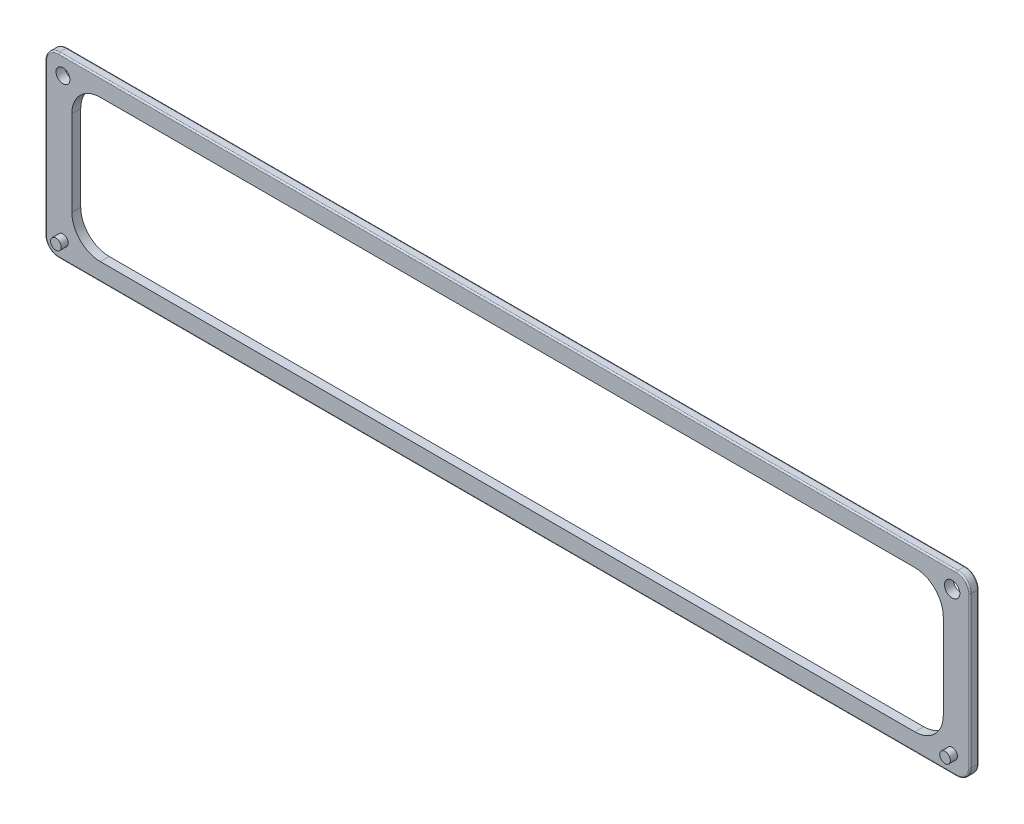
ISO-10303-21;
HEADER;
FILE_DESCRIPTION(('STEP AP214'),'2;1');
FILE_NAME('part.step','',(''),(''),'','','');
FILE_SCHEMA(('AUTOMOTIVE_DESIGN { 1 0 10303 214 1 1 1 1 }'));
ENDSEC;
DATA;
#1=APPLICATION_CONTEXT('core data for automotive mechanical design processes');
#2=APPLICATION_PROTOCOL_DEFINITION('international standard','automotive_design',2000,#1);
#3=PRODUCT_CONTEXT('',#1,'mechanical');
#4=PRODUCT('Part','Part','',(#3));
#5=PRODUCT_RELATED_PRODUCT_CATEGORY('part','',(#4));
#6=PRODUCT_DEFINITION_FORMATION('','',#4);
#7=PRODUCT_DEFINITION_CONTEXT('part definition',#1,'design');
#8=PRODUCT_DEFINITION('design','',#6,#7);
#9=PRODUCT_DEFINITION_SHAPE('','',#8);
#10=(LENGTH_UNIT() NAMED_UNIT(*) SI_UNIT(.MILLI.,.METRE.));
#11=(NAMED_UNIT(*) PLANE_ANGLE_UNIT() SI_UNIT($,.RADIAN.));
#12=(NAMED_UNIT(*) SI_UNIT($,.STERADIAN.) SOLID_ANGLE_UNIT());
#13=UNCERTAINTY_MEASURE_WITH_UNIT(LENGTH_MEASURE(1.E-05),#10,'distance_accuracy_value','');
#14=(GEOMETRIC_REPRESENTATION_CONTEXT(3) GLOBAL_UNCERTAINTY_ASSIGNED_CONTEXT((#13)) GLOBAL_UNIT_ASSIGNED_CONTEXT((#10,
#11,#12)) REPRESENTATION_CONTEXT('',''));
#15=CARTESIAN_POINT('',(0.,0.,0.));
#16=DIRECTION('',(0.,0.,1.));
#17=DIRECTION('',(1.,0.,0.));
#18=AXIS2_PLACEMENT_3D('',#15,#16,#17);
#19=CARTESIAN_POINT('',(41.275,7.9375,0.79375));
#20=DIRECTION('',(-1.,0.,0.));
#21=DIRECTION('',(0.,0.,1.));
#22=AXIS2_PLACEMENT_3D('',#19,#20,#21);
#23=PLANE('',#22);
#24=DIRECTION('',(0.,0.,-1.));
#25=VECTOR('',#24,1.);
#26=CARTESIAN_POINT('',(41.275,6.7437,0.79375));
#27=LINE('',#26,#25);
#28=CARTESIAN_POINT('',(41.275,6.7437,0.127));
#29=VERTEX_POINT('',#28);
#30=CARTESIAN_POINT('',(41.275,6.7437,0.66675));
#31=VERTEX_POINT('',#30);
#32=EDGE_CURVE('E296',#29,#31,#27,.F.);
#33=ORIENTED_EDGE('',*,*,#32,.T.);
#34=DIRECTION('',(0.,1.,0.));
#35=VECTOR('',#34,1.);
#36=CARTESIAN_POINT('',(41.275,-6.7437,0.66675));
#37=LINE('',#36,#35);
#38=CARTESIAN_POINT('',(41.275,-6.7437,0.66675));
#39=VERTEX_POINT('',#38);
#40=EDGE_CURVE('E344',#31,#39,#37,.F.);
#41=ORIENTED_EDGE('',*,*,#40,.T.);
#42=DIRECTION('',(0.,0.,-1.));
#43=VECTOR('',#42,1.);
#44=CARTESIAN_POINT('',(41.275,-6.7437,0.79375));
#45=LINE('',#44,#43);
#46=CARTESIAN_POINT('',(41.275,-6.7437,0.127));
#47=VERTEX_POINT('',#46);
#48=EDGE_CURVE('E293',#39,#47,#45,.T.);
#49=ORIENTED_EDGE('',*,*,#48,.T.);
#50=DIRECTION('',(0.,1.,0.));
#51=VECTOR('',#50,1.);
#52=CARTESIAN_POINT('',(41.275,7.9375,0.127));
#53=LINE('',#52,#51);
#54=EDGE_CURVE('E342',#47,#29,#53,.T.);
#55=ORIENTED_EDGE('',*,*,#54,.T.);
#56=EDGE_LOOP('',(#33,#41,#49,#55));
#57=FACE_BOUND('',#56,.T.);
#58=ADVANCED_FACE('F34',(#57),#23,.F.);
#59=CARTESIAN_POINT('',(-41.275,7.9375,0.79375));
#60=DIRECTION('',(0.,-1.,0.));
#61=DIRECTION('',(0.,0.,-1.));
#62=AXIS2_PLACEMENT_3D('',#59,#60,#61);
#63=PLANE('',#62);
#64=DIRECTION('',(0.,0.,-1.));
#65=VECTOR('',#64,1.);
#66=CARTESIAN_POINT('',(-40.0812,7.9375,0.79375));
#67=LINE('',#66,#65);
#68=CARTESIAN_POINT('',(-40.0812,7.9375,0.127));
#69=VERTEX_POINT('',#68);
#70=CARTESIAN_POINT('',(-40.0812,7.9375,0.66675));
#71=VERTEX_POINT('',#70);
#72=EDGE_CURVE('E287',#69,#71,#67,.F.);
#73=ORIENTED_EDGE('',*,*,#72,.T.);
#74=DIRECTION('',(-1.,0.,0.));
#75=VECTOR('',#74,1.);
#76=CARTESIAN_POINT('',(40.0812,7.9375,0.66675));
#77=LINE('',#76,#75);
#78=CARTESIAN_POINT('',(40.0812,7.9375,0.66675));
#79=VERTEX_POINT('',#78);
#80=EDGE_CURVE('E336',#71,#79,#77,.F.);
#81=ORIENTED_EDGE('',*,*,#80,.T.);
#82=DIRECTION('',(0.,0.,-1.));
#83=VECTOR('',#82,1.);
#84=CARTESIAN_POINT('',(40.0812,7.9375,0.79375));
#85=LINE('',#84,#83);
#86=CARTESIAN_POINT('',(40.0812,7.9375,0.127));
#87=VERTEX_POINT('',#86);
#88=EDGE_CURVE('E290',#79,#87,#85,.T.);
#89=ORIENTED_EDGE('',*,*,#88,.T.);
#90=DIRECTION('',(-1.,0.,0.));
#91=VECTOR('',#90,1.);
#92=CARTESIAN_POINT('',(-41.275,7.9375,0.127));
#93=LINE('',#92,#91);
#94=EDGE_CURVE('E334',#87,#69,#93,.T.);
#95=ORIENTED_EDGE('',*,*,#94,.T.);
#96=EDGE_LOOP('',(#73,#81,#89,#95));
#97=FACE_BOUND('',#96,.T.);
#98=ADVANCED_FACE('F491',(#97),#63,.F.);
#99=CARTESIAN_POINT('',(-41.275,7.9375,0.79375));
#100=DIRECTION('',(1.,0.,0.));
#101=DIRECTION('',(0.,0.,-1.));
#102=AXIS2_PLACEMENT_3D('',#99,#100,#101);
#103=PLANE('',#102);
#104=DIRECTION('',(0.,0.,-1.));
#105=VECTOR('',#104,1.);
#106=CARTESIAN_POINT('',(-41.275,-6.7437,0.79375));
#107=LINE('',#106,#105);
#108=CARTESIAN_POINT('',(-41.275,-6.7437,0.127));
#109=VERTEX_POINT('',#108);
#110=CARTESIAN_POINT('',(-41.275,-6.7437,0.66675));
#111=VERTEX_POINT('',#110);
#112=EDGE_CURVE('E308',#109,#111,#107,.F.);
#113=ORIENTED_EDGE('',*,*,#112,.T.);
#114=DIRECTION('',(0.,-1.,0.));
#115=VECTOR('',#114,1.);
#116=CARTESIAN_POINT('',(-41.275,6.7437,0.66675));
#117=LINE('',#116,#115);
#118=CARTESIAN_POINT('',(-41.275,6.7437,0.66675));
#119=VERTEX_POINT('',#118);
#120=EDGE_CURVE('E11',#111,#119,#117,.F.);
#121=ORIENTED_EDGE('',*,*,#120,.T.);
#122=DIRECTION('',(0.,0.,-1.));
#123=VECTOR('',#122,1.);
#124=CARTESIAN_POINT('',(-41.275,6.7437,0.79375));
#125=LINE('',#124,#123);
#126=CARTESIAN_POINT('',(-41.275,6.7437,0.127));
#127=VERTEX_POINT('',#126);
#128=EDGE_CURVE('E305',#119,#127,#125,.T.);
#129=ORIENTED_EDGE('',*,*,#128,.T.);
#130=DIRECTION('',(0.,-1.,0.));
#131=VECTOR('',#130,1.);
#132=CARTESIAN_POINT('',(-41.275,7.9375,0.127));
#133=LINE('',#132,#131);
#134=EDGE_CURVE('E43',#127,#109,#133,.T.);
#135=ORIENTED_EDGE('',*,*,#134,.T.);
#136=EDGE_LOOP('',(#113,#121,#129,#135));
#137=FACE_BOUND('',#136,.T.);
#138=ADVANCED_FACE('F478',(#137),#103,.F.);
#139=CARTESIAN_POINT('',(-41.275,-7.9375,0.79375));
#140=DIRECTION('',(0.,1.,0.));
#141=DIRECTION('',(0.,0.,1.));
#142=AXIS2_PLACEMENT_3D('',#139,#140,#141);
#143=PLANE('',#142);
#144=DIRECTION('',(0.,0.,-1.));
#145=VECTOR('',#144,1.);
#146=CARTESIAN_POINT('',(40.0812,-7.9375,0.79375));
#147=LINE('',#146,#145);
#148=CARTESIAN_POINT('',(40.0812,-7.9375,0.127));
#149=VERTEX_POINT('',#148);
#150=CARTESIAN_POINT('',(40.0812,-7.9375,0.66675));
#151=VERTEX_POINT('',#150);
#152=EDGE_CURVE('E302',#149,#151,#147,.F.);
#153=ORIENTED_EDGE('',*,*,#152,.T.);
#154=DIRECTION('',(1.,0.,0.));
#155=VECTOR('',#154,1.);
#156=CARTESIAN_POINT('',(-40.0812,-7.9375,0.66675));
#157=LINE('',#156,#155);
#158=CARTESIAN_POINT('',(-40.0812,-7.9375,0.66675));
#159=VERTEX_POINT('',#158);
#160=EDGE_CURVE('E352',#151,#159,#157,.F.);
#161=ORIENTED_EDGE('',*,*,#160,.T.);
#162=DIRECTION('',(0.,0.,-1.));
#163=VECTOR('',#162,1.);
#164=CARTESIAN_POINT('',(-40.0812,-7.9375,0.79375));
#165=LINE('',#164,#163);
#166=CARTESIAN_POINT('',(-40.0812,-7.9375,0.127));
#167=VERTEX_POINT('',#166);
#168=EDGE_CURVE('E299',#159,#167,#165,.T.);
#169=ORIENTED_EDGE('',*,*,#168,.T.);
#170=DIRECTION('',(1.,0.,0.));
#171=VECTOR('',#170,1.);
#172=CARTESIAN_POINT('',(-41.275,-7.9375,0.127));
#173=LINE('',#172,#171);
#174=EDGE_CURVE('E350',#167,#149,#173,.T.);
#175=ORIENTED_EDGE('',*,*,#174,.T.);
#176=EDGE_LOOP('',(#153,#161,#169,#175));
#177=FACE_BOUND('',#176,.T.);
#178=ADVANCED_FACE('F457',(#177),#143,.F.);
#179=CARTESIAN_POINT('',(0.,0.,0.79375));
#180=DIRECTION('',(0.,0.,1.));
#181=DIRECTION('',(1.,0.,0.));
#182=AXIS2_PLACEMENT_3D('',#179,#180,#181);
#183=PLANE('',#182);
#184=DIRECTION('',(-1.,0.,0.));
#185=VECTOR('',#184,1.);
#186=CARTESIAN_POINT('',(-40.0812,7.8105,0.79375));
#187=LINE('',#186,#185);
#188=CARTESIAN_POINT('',(40.0812,7.8105,0.79375));
#189=VERTEX_POINT('',#188);
#190=CARTESIAN_POINT('',(-40.0812,7.8105,0.79375));
#191=VERTEX_POINT('',#190);
#192=EDGE_CURVE('E323',#189,#191,#187,.T.);
#193=ORIENTED_EDGE('',*,*,#192,.T.);
#194=CARTESIAN_POINT('',(-40.0812,6.7437,0.79375));
#195=DIRECTION('',(0.,0.,1.));
#196=DIRECTION('',(1.,0.,0.));
#197=AXIS2_PLACEMENT_3D('',#194,#195,#196);
#198=CIRCLE('',#197,1.0668);
#199=CARTESIAN_POINT('',(-41.148,6.7437,0.79375));
#200=VERTEX_POINT('',#199);
#201=EDGE_CURVE('E325',#191,#200,#198,.T.);
#202=ORIENTED_EDGE('',*,*,#201,.T.);
#203=DIRECTION('',(0.,-1.,0.));
#204=VECTOR('',#203,1.);
#205=CARTESIAN_POINT('',(-41.148,-6.7437,0.79375));
#206=LINE('',#205,#204);
#207=CARTESIAN_POINT('',(-41.148,-6.7437,0.79375));
#208=VERTEX_POINT('',#207);
#209=EDGE_CURVE('E311',#200,#208,#206,.T.);
#210=ORIENTED_EDGE('',*,*,#209,.T.);
#211=CARTESIAN_POINT('',(-40.0812,-6.7437,0.79375));
#212=DIRECTION('',(0.,0.,1.));
#213=DIRECTION('',(1.,0.,0.));
#214=AXIS2_PLACEMENT_3D('',#211,#212,#213);
#215=CIRCLE('',#214,1.0668);
#216=CARTESIAN_POINT('',(-40.0812,-7.8105,0.79375));
#217=VERTEX_POINT('',#216);
#218=EDGE_CURVE('E313',#208,#217,#215,.T.);
#219=ORIENTED_EDGE('',*,*,#218,.T.);
#220=DIRECTION('',(1.,0.,0.));
#221=VECTOR('',#220,1.);
#222=CARTESIAN_POINT('',(40.0812,-7.8105,0.79375));
#223=LINE('',#222,#221);
#224=CARTESIAN_POINT('',(40.0812,-7.8105,0.79375));
#225=VERTEX_POINT('',#224);
#226=EDGE_CURVE('E315',#217,#225,#223,.T.);
#227=ORIENTED_EDGE('',*,*,#226,.T.);
#228=CARTESIAN_POINT('',(40.0812,-6.7437,0.79375));
#229=DIRECTION('',(0.,0.,1.));
#230=DIRECTION('',(1.,0.,0.));
#231=AXIS2_PLACEMENT_3D('',#228,#229,#230);
#232=CIRCLE('',#231,1.0668);
#233=CARTESIAN_POINT('',(41.148,-6.7437,0.79375));
#234=VERTEX_POINT('',#233);
#235=EDGE_CURVE('E317',#225,#234,#232,.T.);
#236=ORIENTED_EDGE('',*,*,#235,.T.);
#237=DIRECTION('',(0.,1.,0.));
#238=VECTOR('',#237,1.);
#239=CARTESIAN_POINT('',(41.148,6.7437,0.79375));
#240=LINE('',#239,#238);
#241=CARTESIAN_POINT('',(41.148,6.7437,0.79375));
#242=VERTEX_POINT('',#241);
#243=EDGE_CURVE('E319',#234,#242,#240,.T.);
#244=ORIENTED_EDGE('',*,*,#243,.T.);
#245=CARTESIAN_POINT('',(40.0812,6.7437,0.79375));
#246=DIRECTION('',(0.,0.,1.));
#247=DIRECTION('',(1.,0.,0.));
#248=AXIS2_PLACEMENT_3D('',#245,#246,#247);
#249=CIRCLE('',#248,1.0668);
#250=EDGE_CURVE('E321',#242,#189,#249,.T.);
#251=ORIENTED_EDGE('',*,*,#250,.T.);
#252=EDGE_LOOP('',(#193,#202,#210,#219,#227,#236,#244,#251));
#253=FACE_BOUND('',#252,.T.);
#254=CARTESIAN_POINT('',(-39.6875,6.35,0.79375));
#255=DIRECTION('',(0.,0.,1.));
#256=DIRECTION('',(1.,0.,0.));
#257=AXIS2_PLACEMENT_3D('',#254,#255,#256);
#258=CIRCLE('',#257,0.622300000000001);
#259=CARTESIAN_POINT('',(-39.0652,6.35,0.79375));
#260=VERTEX_POINT('',#259);
#261=EDGE_CURVE('E229',#260,#260,#258,.T.);
#262=ORIENTED_EDGE('',*,*,#261,.F.);
#263=EDGE_LOOP('',(#262));
#264=FACE_BOUND('',#263,.T.);
#265=CARTESIAN_POINT('',(39.6875,6.35,0.79375));
#266=DIRECTION('',(0.,0.,1.));
#267=DIRECTION('',(1.,0.,0.));
#268=AXIS2_PLACEMENT_3D('',#265,#266,#267);
#269=CIRCLE('',#268,0.685800000000001);
#270=CARTESIAN_POINT('',(40.3733,6.35,0.79375));
#271=VERTEX_POINT('',#270);
#272=EDGE_CURVE('E878',#271,#271,#269,.T.);
#273=ORIENTED_EDGE('',*,*,#272,.F.);
#274=EDGE_LOOP('',(#273));
#275=FACE_BOUND('',#274,.T.);
#276=CARTESIAN_POINT('',(36.35375,-3.81,0.79375));
#277=DIRECTION('',(0.,0.,1.));
#278=DIRECTION('',(1.,0.,0.));
#279=AXIS2_PLACEMENT_3D('',#276,#277,#278);
#280=CIRCLE('',#279,2.54);
#281=CARTESIAN_POINT('',(36.35375,-6.35,0.79375));
#282=VERTEX_POINT('',#281);
#283=CARTESIAN_POINT('',(38.89375,-3.81,0.79375));
#284=VERTEX_POINT('',#283);
#285=EDGE_CURVE('E205',#282,#284,#280,.T.);
#286=ORIENTED_EDGE('',*,*,#285,.F.);
#287=DIRECTION('',(1.,0.,0.));
#288=VECTOR('',#287,1.);
#289=CARTESIAN_POINT('',(-36.35375,-6.35,0.79375));
#290=LINE('',#289,#288);
#291=CARTESIAN_POINT('',(-36.35375,-6.35,0.79375));
#292=VERTEX_POINT('',#291);
#293=EDGE_CURVE('E223',#292,#282,#290,.T.);
#294=ORIENTED_EDGE('',*,*,#293,.F.);
#295=CARTESIAN_POINT('',(-36.35375,-3.81,0.79375));
#296=DIRECTION('',(0.,0.,1.));
#297=DIRECTION('',(1.,0.,0.));
#298=AXIS2_PLACEMENT_3D('',#295,#296,#297);
#299=CIRCLE('',#298,2.54);
#300=CARTESIAN_POINT('',(-38.89375,-3.81,0.79375));
#301=VERTEX_POINT('',#300);
#302=EDGE_CURVE('E226',#301,#292,#299,.T.);
#303=ORIENTED_EDGE('',*,*,#302,.F.);
#304=DIRECTION('',(0.,-1.,0.));
#305=VECTOR('',#304,1.);
#306=CARTESIAN_POINT('',(-38.89375,3.81,0.79375));
#307=LINE('',#306,#305);
#308=CARTESIAN_POINT('',(-38.89375,3.81,0.79375));
#309=VERTEX_POINT('',#308);
#310=EDGE_CURVE('E257',#309,#301,#307,.T.);
#311=ORIENTED_EDGE('',*,*,#310,.F.);
#312=CARTESIAN_POINT('',(-36.35375,3.81,0.79375));
#313=DIRECTION('',(0.,0.,1.));
#314=DIRECTION('',(-1.,0.,0.));
#315=AXIS2_PLACEMENT_3D('',#312,#313,#314);
#316=CIRCLE('',#315,2.54);
#317=CARTESIAN_POINT('',(-36.35375,6.35,0.79375));
#318=VERTEX_POINT('',#317);
#319=EDGE_CURVE('E254',#318,#309,#316,.T.);
#320=ORIENTED_EDGE('',*,*,#319,.F.);
#321=DIRECTION('',(-1.,0.,0.));
#322=VECTOR('',#321,1.);
#323=CARTESIAN_POINT('',(-36.35375,6.35,0.79375));
#324=LINE('',#323,#322);
#325=CARTESIAN_POINT('',(36.35375,6.35,0.79375));
#326=VERTEX_POINT('',#325);
#327=EDGE_CURVE('E251',#326,#318,#324,.T.);
#328=ORIENTED_EDGE('',*,*,#327,.F.);
#329=CARTESIAN_POINT('',(36.35375,3.81,0.79375));
#330=DIRECTION('',(0.,0.,1.));
#331=DIRECTION('',(-1.,0.,0.));
#332=AXIS2_PLACEMENT_3D('',#329,#330,#331);
#333=CIRCLE('',#332,2.54);
#334=CARTESIAN_POINT('',(38.89375,3.81,0.79375));
#335=VERTEX_POINT('',#334);
#336=EDGE_CURVE('E248',#335,#326,#333,.T.);
#337=ORIENTED_EDGE('',*,*,#336,.F.);
#338=DIRECTION('',(0.,1.,0.));
#339=VECTOR('',#338,1.);
#340=CARTESIAN_POINT('',(38.89375,3.81,0.79375));
#341=LINE('',#340,#339);
#342=EDGE_CURVE('E246',#284,#335,#341,.T.);
#343=ORIENTED_EDGE('',*,*,#342,.F.);
#344=EDGE_LOOP('',(#286,#294,#303,#311,#320,#328,#337,#343));
#345=FACE_BOUND('',#344,.T.);
#346=CARTESIAN_POINT('',(-39.6875,-6.35,0.79375));
#347=DIRECTION('',(0.,0.,1.));
#348=DIRECTION('',(-1.,0.,0.));
#349=AXIS2_PLACEMENT_3D('',#346,#347,#348);
#350=CIRCLE('',#349,0.474599000000001);
#351=CARTESIAN_POINT('',(-40.162099,-6.35,0.79375));
#352=VERTEX_POINT('',#351);
#353=EDGE_CURVE('E264',#352,#352,#350,.T.);
#354=ORIENTED_EDGE('',*,*,#353,.F.);
#355=EDGE_LOOP('',(#354));
#356=FACE_BOUND('',#355,.T.);
#357=CARTESIAN_POINT('',(39.6875,-6.35,0.79375));
#358=DIRECTION('',(0.,0.,1.));
#359=DIRECTION('',(1.,0.,0.));
#360=AXIS2_PLACEMENT_3D('',#357,#358,#359);
#361=CIRCLE('',#360,0.474599000000001);
#362=CARTESIAN_POINT('',(40.162099,-6.35,0.79375));
#363=VERTEX_POINT('',#362);
#364=EDGE_CURVE('E284',#363,#363,#361,.T.);
#365=ORIENTED_EDGE('',*,*,#364,.F.);
#366=EDGE_LOOP('',(#365));
#367=FACE_BOUND('',#366,.T.);
#368=ADVANCED_FACE('F447',(#253,#264,#275,#345,#356,#367),#183,.T.);
#369=CARTESIAN_POINT('',(0.,0.,0.));
#370=DIRECTION('',(0.,0.,1.));
#371=DIRECTION('',(1.,0.,0.));
#372=AXIS2_PLACEMENT_3D('',#369,#370,#371);
#373=PLANE('',#372);
#374=DIRECTION('',(0.,-1.,0.));
#375=VECTOR('',#374,1.);
#376=CARTESIAN_POINT('',(-41.148,0.,0.));
#377=LINE('',#376,#375);
#378=CARTESIAN_POINT('',(-41.148,-6.7437,0.));
#379=VERTEX_POINT('',#378);
#380=CARTESIAN_POINT('',(-41.148,6.7437,0.));
#381=VERTEX_POINT('',#380);
#382=EDGE_CURVE('E358',#379,#381,#377,.F.);
#383=ORIENTED_EDGE('',*,*,#382,.T.);
#384=CARTESIAN_POINT('',(-40.0812,6.7437,0.));
#385=DIRECTION('',(0.,0.,1.));
#386=DIRECTION('',(1.,0.,0.));
#387=AXIS2_PLACEMENT_3D('',#384,#385,#386);
#388=CIRCLE('',#387,1.0668);
#389=CARTESIAN_POINT('',(-40.0812,7.8105,0.));
#390=VERTEX_POINT('',#389);
#391=EDGE_CURVE('E371',#381,#390,#388,.F.);
#392=ORIENTED_EDGE('',*,*,#391,.T.);
#393=DIRECTION('',(-1.,0.,0.));
#394=VECTOR('',#393,1.);
#395=CARTESIAN_POINT('',(0.,7.8105,0.));
#396=LINE('',#395,#394);
#397=CARTESIAN_POINT('',(40.0812,7.8105,0.));
#398=VERTEX_POINT('',#397);
#399=EDGE_CURVE('E58',#390,#398,#396,.F.);
#400=ORIENTED_EDGE('',*,*,#399,.T.);
#401=CARTESIAN_POINT('',(40.0812,6.7437,0.));
#402=DIRECTION('',(0.,0.,1.));
#403=DIRECTION('',(1.,0.,0.));
#404=AXIS2_PLACEMENT_3D('',#401,#402,#403);
#405=CIRCLE('',#404,1.0668);
#406=CARTESIAN_POINT('',(41.148,6.7437,0.));
#407=VERTEX_POINT('',#406);
#408=EDGE_CURVE('E368',#398,#407,#405,.F.);
#409=ORIENTED_EDGE('',*,*,#408,.T.);
#410=DIRECTION('',(0.,1.,0.));
#411=VECTOR('',#410,1.);
#412=CARTESIAN_POINT('',(41.148,0.,0.));
#413=LINE('',#412,#411);
#414=CARTESIAN_POINT('',(41.148,-6.7437,0.));
#415=VERTEX_POINT('',#414);
#416=EDGE_CURVE('E366',#407,#415,#413,.F.);
#417=ORIENTED_EDGE('',*,*,#416,.T.);
#418=CARTESIAN_POINT('',(40.0812,-6.7437,0.));
#419=DIRECTION('',(0.,0.,1.));
#420=DIRECTION('',(1.,0.,0.));
#421=AXIS2_PLACEMENT_3D('',#418,#419,#420);
#422=CIRCLE('',#421,1.0668);
#423=CARTESIAN_POINT('',(40.0812,-7.8105,0.));
#424=VERTEX_POINT('',#423);
#425=EDGE_CURVE('E364',#415,#424,#422,.F.);
#426=ORIENTED_EDGE('',*,*,#425,.T.);
#427=DIRECTION('',(1.,0.,0.));
#428=VECTOR('',#427,1.);
#429=CARTESIAN_POINT('',(0.,-7.8105,0.));
#430=LINE('',#429,#428);
#431=CARTESIAN_POINT('',(-40.0812,-7.8105,0.));
#432=VERTEX_POINT('',#431);
#433=EDGE_CURVE('E362',#424,#432,#430,.F.);
#434=ORIENTED_EDGE('',*,*,#433,.T.);
#435=CARTESIAN_POINT('',(-40.0812,-6.7437,0.));
#436=DIRECTION('',(0.,0.,1.));
#437=DIRECTION('',(1.,0.,0.));
#438=AXIS2_PLACEMENT_3D('',#435,#436,#437);
#439=CIRCLE('',#438,1.0668);
#440=EDGE_CURVE('E360',#432,#379,#439,.F.);
#441=ORIENTED_EDGE('',*,*,#440,.T.);
#442=EDGE_LOOP('',(#383,#392,#400,#409,#417,#426,#434,#441));
#443=FACE_BOUND('',#442,.T.);
#444=CARTESIAN_POINT('',(-39.6875,6.35,0.));
#445=DIRECTION('',(0.,0.,1.));
#446=DIRECTION('',(1.,0.,0.));
#447=AXIS2_PLACEMENT_3D('',#444,#445,#446);
#448=CIRCLE('',#447,0.622300000000001);
#449=CARTESIAN_POINT('',(-39.0652,6.35,0.));
#450=VERTEX_POINT('',#449);
#451=EDGE_CURVE('E882',#450,#450,#448,.T.);
#452=ORIENTED_EDGE('',*,*,#451,.T.);
#453=EDGE_LOOP('',(#452));
#454=FACE_BOUND('',#453,.T.);
#455=CARTESIAN_POINT('',(39.6875,6.35,0.));
#456=DIRECTION('',(0.,0.,1.));
#457=DIRECTION('',(1.,0.,0.));
#458=AXIS2_PLACEMENT_3D('',#455,#456,#457);
#459=CIRCLE('',#458,0.685800000000001);
#460=CARTESIAN_POINT('',(40.3733,6.35,0.));
#461=VERTEX_POINT('',#460);
#462=EDGE_CURVE('E396',#461,#461,#459,.T.);
#463=ORIENTED_EDGE('',*,*,#462,.T.);
#464=EDGE_LOOP('',(#463));
#465=FACE_BOUND('',#464,.T.);
#466=DIRECTION('',(1.,0.,0.));
#467=VECTOR('',#466,1.);
#468=CARTESIAN_POINT('',(-36.35375,-6.35,0.));
#469=LINE('',#468,#467);
#470=CARTESIAN_POINT('',(-36.35375,-6.35,0.));
#471=VERTEX_POINT('',#470);
#472=CARTESIAN_POINT('',(36.35375,-6.35,0.));
#473=VERTEX_POINT('',#472);
#474=EDGE_CURVE('E210',#471,#473,#469,.T.);
#475=ORIENTED_EDGE('',*,*,#474,.T.);
#476=CARTESIAN_POINT('',(36.35375,-3.81,0.));
#477=DIRECTION('',(0.,0.,1.));
#478=DIRECTION('',(1.,0.,0.));
#479=AXIS2_PLACEMENT_3D('',#476,#477,#478);
#480=CIRCLE('',#479,2.54);
#481=CARTESIAN_POINT('',(38.89375,-3.81,0.));
#482=VERTEX_POINT('',#481);
#483=EDGE_CURVE('E202',#473,#482,#480,.T.);
#484=ORIENTED_EDGE('',*,*,#483,.T.);
#485=DIRECTION('',(0.,1.,0.));
#486=VECTOR('',#485,1.);
#487=CARTESIAN_POINT('',(38.89375,3.81,0.));
#488=LINE('',#487,#486);
#489=CARTESIAN_POINT('',(38.89375,3.81,0.));
#490=VERTEX_POINT('',#489);
#491=EDGE_CURVE('E214',#482,#490,#488,.T.);
#492=ORIENTED_EDGE('',*,*,#491,.T.);
#493=CARTESIAN_POINT('',(36.35375,3.81,0.));
#494=DIRECTION('',(0.,0.,1.));
#495=DIRECTION('',(-1.,0.,0.));
#496=AXIS2_PLACEMENT_3D('',#493,#494,#495);
#497=CIRCLE('',#496,2.54);
#498=CARTESIAN_POINT('',(36.35375,6.35,0.));
#499=VERTEX_POINT('',#498);
#500=EDGE_CURVE('E218',#490,#499,#497,.T.);
#501=ORIENTED_EDGE('',*,*,#500,.T.);
#502=DIRECTION('',(-1.,0.,0.));
#503=VECTOR('',#502,1.);
#504=CARTESIAN_POINT('',(-36.35375,6.35,0.));
#505=LINE('',#504,#503);
#506=CARTESIAN_POINT('',(-36.35375,6.35,0.));
#507=VERTEX_POINT('',#506);
#508=EDGE_CURVE('E233',#499,#507,#505,.T.);
#509=ORIENTED_EDGE('',*,*,#508,.T.);
#510=CARTESIAN_POINT('',(-36.35375,3.81,0.));
#511=DIRECTION('',(0.,0.,1.));
#512=DIRECTION('',(-1.,0.,0.));
#513=AXIS2_PLACEMENT_3D('',#510,#511,#512);
#514=CIRCLE('',#513,2.54);
#515=CARTESIAN_POINT('',(-38.89375,3.81,0.));
#516=VERTEX_POINT('',#515);
#517=EDGE_CURVE('E236',#507,#516,#514,.T.);
#518=ORIENTED_EDGE('',*,*,#517,.T.);
#519=DIRECTION('',(0.,-1.,0.));
#520=VECTOR('',#519,1.);
#521=CARTESIAN_POINT('',(-38.89375,3.81,0.));
#522=LINE('',#521,#520);
#523=CARTESIAN_POINT('',(-38.89375,-3.81,0.));
#524=VERTEX_POINT('',#523);
#525=EDGE_CURVE('E239',#516,#524,#522,.T.);
#526=ORIENTED_EDGE('',*,*,#525,.T.);
#527=CARTESIAN_POINT('',(-36.35375,-3.81,0.));
#528=DIRECTION('',(0.,0.,1.));
#529=DIRECTION('',(1.,0.,0.));
#530=AXIS2_PLACEMENT_3D('',#527,#528,#529);
#531=CIRCLE('',#530,2.54);
#532=EDGE_CURVE('E242',#524,#471,#531,.T.);
#533=ORIENTED_EDGE('',*,*,#532,.T.);
#534=EDGE_LOOP('',(#475,#484,#492,#501,#509,#518,#526,#533));
#535=FACE_BOUND('',#534,.T.);
#536=ADVANCED_FACE('F220',(#443,#454,#465,#535),#373,.F.);
#537=CARTESIAN_POINT('',(39.6875,-6.35,1.42875));
#538=DIRECTION('',(0.,0.,-1.));
#539=DIRECTION('',(-1.,0.,0.));
#540=AXIS2_PLACEMENT_3D('',#537,#538,#539);
#541=CYLINDRICAL_SURFACE('',#540,0.474599000000001);
#542=CARTESIAN_POINT('',(39.6875,-6.35,1.42875));
#543=DIRECTION('',(0.,0.,-1.));
#544=DIRECTION('',(1.,0.,0.));
#545=AXIS2_PLACEMENT_3D('',#542,#543,#544);
#546=CIRCLE('',#545,0.474599000000001);
#547=CARTESIAN_POINT('',(40.162099,-6.35,1.42875));
#548=VERTEX_POINT('',#547);
#549=EDGE_CURVE('E279',#548,#548,#546,.T.);
#550=ORIENTED_EDGE('',*,*,#549,.T.);
#551=EDGE_LOOP('',(#550));
#552=FACE_BOUND('',#551,.T.);
#553=ORIENTED_EDGE('',*,*,#364,.T.);
#554=EDGE_LOOP('',(#553));
#555=FACE_BOUND('',#554,.T.);
#556=ADVANCED_FACE('F777',(#552,#555),#541,.T.);
#557=CARTESIAN_POINT('',(39.6875,-6.35,1.42875));
#558=DIRECTION('',(0.,0.,1.));
#559=DIRECTION('',(1.,0.,0.));
#560=AXIS2_PLACEMENT_3D('',#557,#558,#559);
#561=PLANE('',#560);
#562=ORIENTED_EDGE('',*,*,#549,.F.);
#563=EDGE_LOOP('',(#562));
#564=FACE_BOUND('',#563,.T.);
#565=ADVANCED_FACE('F768',(#564),#561,.T.);
#566=CARTESIAN_POINT('',(-39.6875,-6.35,1.42875));
#567=DIRECTION('',(0.,0.,-1.));
#568=DIRECTION('',(-1.,0.,0.));
#569=AXIS2_PLACEMENT_3D('',#566,#567,#568);
#570=CYLINDRICAL_SURFACE('',#569,0.474599000000001);
#571=CARTESIAN_POINT('',(-39.6875,-6.35,1.42875));
#572=DIRECTION('',(0.,0.,1.));
#573=DIRECTION('',(-1.,0.,0.));
#574=AXIS2_PLACEMENT_3D('',#571,#572,#573);
#575=CIRCLE('',#574,0.474599000000001);
#576=CARTESIAN_POINT('',(-40.162099,-6.35,1.42875));
#577=VERTEX_POINT('',#576);
#578=EDGE_CURVE('E276',#577,#577,#575,.T.);
#579=ORIENTED_EDGE('',*,*,#578,.F.);
#580=EDGE_LOOP('',(#579));
#581=FACE_BOUND('',#580,.T.);
#582=ORIENTED_EDGE('',*,*,#353,.T.);
#583=EDGE_LOOP('',(#582));
#584=FACE_BOUND('',#583,.T.);
#585=ADVANCED_FACE('F759',(#581,#584),#570,.T.);
#586=CARTESIAN_POINT('',(-39.6875,-6.35,1.42875));
#587=DIRECTION('',(0.,0.,1.));
#588=DIRECTION('',(-1.,0.,0.));
#589=AXIS2_PLACEMENT_3D('',#586,#587,#588);
#590=PLANE('',#589);
#591=ORIENTED_EDGE('',*,*,#578,.T.);
#592=EDGE_LOOP('',(#591));
#593=FACE_BOUND('',#592,.T.);
#594=ADVANCED_FACE('F751',(#593),#590,.T.);
#595=CARTESIAN_POINT('',(36.35375,-3.81,0.));
#596=DIRECTION('',(0.,0.,1.));
#597=DIRECTION('',(1.,0.,0.));
#598=AXIS2_PLACEMENT_3D('',#595,#596,#597);
#599=CYLINDRICAL_SURFACE('',#598,2.54);
#600=ORIENTED_EDGE('',*,*,#285,.T.);
#601=DIRECTION('',(0.,0.,1.));
#602=VECTOR('',#601,1.);
#603=CARTESIAN_POINT('',(38.89375,-3.81,0.));
#604=LINE('',#603,#602);
#605=EDGE_CURVE('E198',#482,#284,#604,.T.);
#606=ORIENTED_EDGE('',*,*,#605,.F.);
#607=ORIENTED_EDGE('',*,*,#483,.F.);
#608=DIRECTION('',(0.,0.,1.));
#609=VECTOR('',#608,1.);
#610=CARTESIAN_POINT('',(36.35375,-6.35,0.));
#611=LINE('',#610,#609);
#612=EDGE_CURVE('E262',#473,#282,#611,.T.);
#613=ORIENTED_EDGE('',*,*,#612,.T.);
#614=EDGE_LOOP('',(#600,#606,#607,#613));
#615=FACE_BOUND('',#614,.T.);
#616=ADVANCED_FACE('F200',(#615),#599,.F.);
#617=CARTESIAN_POINT('',(-36.35375,-6.35,0.));
#618=DIRECTION('',(0.,-1.,0.));
#619=DIRECTION('',(0.,0.,-1.));
#620=AXIS2_PLACEMENT_3D('',#617,#618,#619);
#621=PLANE('',#620);
#622=ORIENTED_EDGE('',*,*,#293,.T.);
#623=ORIENTED_EDGE('',*,*,#612,.F.);
#624=ORIENTED_EDGE('',*,*,#474,.F.);
#625=DIRECTION('',(0.,0.,1.));
#626=VECTOR('',#625,1.);
#627=CARTESIAN_POINT('',(-36.35375,-6.35,0.));
#628=LINE('',#627,#626);
#629=EDGE_CURVE('E265',#471,#292,#628,.T.);
#630=ORIENTED_EDGE('',*,*,#629,.T.);
#631=EDGE_LOOP('',(#622,#623,#624,#630));
#632=FACE_BOUND('',#631,.T.);
#633=ADVANCED_FACE('F734',(#632),#621,.F.);
#634=CARTESIAN_POINT('',(-36.35375,-3.81,0.));
#635=DIRECTION('',(0.,0.,1.));
#636=DIRECTION('',(1.,0.,0.));
#637=AXIS2_PLACEMENT_3D('',#634,#635,#636);
#638=CYLINDRICAL_SURFACE('',#637,2.54);
#639=ORIENTED_EDGE('',*,*,#302,.T.);
#640=ORIENTED_EDGE('',*,*,#629,.F.);
#641=ORIENTED_EDGE('',*,*,#532,.F.);
#642=DIRECTION('',(0.,0.,1.));
#643=VECTOR('',#642,1.);
#644=CARTESIAN_POINT('',(-38.89375,-3.81,0.));
#645=LINE('',#644,#643);
#646=EDGE_CURVE('E267',#524,#301,#645,.T.);
#647=ORIENTED_EDGE('',*,*,#646,.T.);
#648=EDGE_LOOP('',(#639,#640,#641,#647));
#649=FACE_BOUND('',#648,.T.);
#650=ADVANCED_FACE('F725',(#649),#638,.F.);
#651=CARTESIAN_POINT('',(-38.89375,3.81,0.));
#652=DIRECTION('',(-1.,0.,0.));
#653=DIRECTION('',(0.,0.,1.));
#654=AXIS2_PLACEMENT_3D('',#651,#652,#653);
#655=PLANE('',#654);
#656=ORIENTED_EDGE('',*,*,#310,.T.);
#657=ORIENTED_EDGE('',*,*,#646,.F.);
#658=ORIENTED_EDGE('',*,*,#525,.F.);
#659=DIRECTION('',(0.,0.,1.));
#660=VECTOR('',#659,1.);
#661=CARTESIAN_POINT('',(-38.89375,3.81,0.));
#662=LINE('',#661,#660);
#663=EDGE_CURVE('E269',#516,#309,#662,.T.);
#664=ORIENTED_EDGE('',*,*,#663,.T.);
#665=EDGE_LOOP('',(#656,#657,#658,#664));
#666=FACE_BOUND('',#665,.T.);
#667=ADVANCED_FACE('F716',(#666),#655,.F.);
#668=CARTESIAN_POINT('',(-36.35375,3.81,0.));
#669=DIRECTION('',(0.,0.,1.));
#670=DIRECTION('',(1.,0.,0.));
#671=AXIS2_PLACEMENT_3D('',#668,#669,#670);
#672=CYLINDRICAL_SURFACE('',#671,2.54);
#673=ORIENTED_EDGE('',*,*,#319,.T.);
#674=ORIENTED_EDGE('',*,*,#663,.F.);
#675=ORIENTED_EDGE('',*,*,#517,.F.);
#676=DIRECTION('',(0.,0.,1.));
#677=VECTOR('',#676,1.);
#678=CARTESIAN_POINT('',(-36.35375,6.35,0.));
#679=LINE('',#678,#677);
#680=EDGE_CURVE('E271',#507,#318,#679,.T.);
#681=ORIENTED_EDGE('',*,*,#680,.T.);
#682=EDGE_LOOP('',(#673,#674,#675,#681));
#683=FACE_BOUND('',#682,.T.);
#684=ADVANCED_FACE('F707',(#683),#672,.F.);
#685=CARTESIAN_POINT('',(-36.35375,6.35,0.));
#686=DIRECTION('',(0.,1.,0.));
#687=DIRECTION('',(0.,0.,1.));
#688=AXIS2_PLACEMENT_3D('',#685,#686,#687);
#689=PLANE('',#688);
#690=ORIENTED_EDGE('',*,*,#327,.T.);
#691=ORIENTED_EDGE('',*,*,#680,.F.);
#692=ORIENTED_EDGE('',*,*,#508,.F.);
#693=DIRECTION('',(0.,0.,1.));
#694=VECTOR('',#693,1.);
#695=CARTESIAN_POINT('',(36.35375,6.35,0.));
#696=LINE('',#695,#694);
#697=EDGE_CURVE('E273',#499,#326,#696,.T.);
#698=ORIENTED_EDGE('',*,*,#697,.T.);
#699=EDGE_LOOP('',(#690,#691,#692,#698));
#700=FACE_BOUND('',#699,.T.);
#701=ADVANCED_FACE('F698',(#700),#689,.F.);
#702=CARTESIAN_POINT('',(36.35375,3.81,0.));
#703=DIRECTION('',(0.,0.,1.));
#704=DIRECTION('',(1.,0.,0.));
#705=AXIS2_PLACEMENT_3D('',#702,#703,#704);
#706=CYLINDRICAL_SURFACE('',#705,2.54);
#707=ORIENTED_EDGE('',*,*,#336,.T.);
#708=ORIENTED_EDGE('',*,*,#697,.F.);
#709=ORIENTED_EDGE('',*,*,#500,.F.);
#710=DIRECTION('',(0.,0.,1.));
#711=VECTOR('',#710,1.);
#712=CARTESIAN_POINT('',(38.89375,3.81,0.));
#713=LINE('',#712,#711);
#714=EDGE_CURVE('E209',#490,#335,#713,.T.);
#715=ORIENTED_EDGE('',*,*,#714,.T.);
#716=EDGE_LOOP('',(#707,#708,#709,#715));
#717=FACE_BOUND('',#716,.T.);
#718=ADVANCED_FACE('F690',(#717),#706,.F.);
#719=CARTESIAN_POINT('',(38.89375,3.81,0.));
#720=DIRECTION('',(1.,0.,0.));
#721=DIRECTION('',(0.,1.,0.));
#722=AXIS2_PLACEMENT_3D('',#719,#720,#721);
#723=PLANE('',#722);
#724=ORIENTED_EDGE('',*,*,#342,.T.);
#725=ORIENTED_EDGE('',*,*,#714,.F.);
#726=ORIENTED_EDGE('',*,*,#491,.F.);
#727=ORIENTED_EDGE('',*,*,#605,.T.);
#728=EDGE_LOOP('',(#724,#725,#726,#727));
#729=FACE_BOUND('',#728,.T.);
#730=ADVANCED_FACE('F215',(#729),#723,.F.);
#731=CARTESIAN_POINT('',(39.6875,6.35,0.));
#732=DIRECTION('',(0.,0.,1.));
#733=DIRECTION('',(1.,0.,0.));
#734=AXIS2_PLACEMENT_3D('',#731,#732,#733);
#735=CYLINDRICAL_SURFACE('',#734,0.685800000000001);
#736=ORIENTED_EDGE('',*,*,#272,.T.);
#737=EDGE_LOOP('',(#736));
#738=FACE_BOUND('',#737,.T.);
#739=ORIENTED_EDGE('',*,*,#462,.F.);
#740=EDGE_LOOP('',(#739));
#741=FACE_BOUND('',#740,.T.);
#742=ADVANCED_FACE('F673',(#738,#741),#735,.F.);
#743=CARTESIAN_POINT('',(-39.6875,6.35,0.));
#744=DIRECTION('',(0.,0.,1.));
#745=DIRECTION('',(1.,0.,0.));
#746=AXIS2_PLACEMENT_3D('',#743,#744,#745);
#747=CYLINDRICAL_SURFACE('',#746,0.622300000000001);
#748=ORIENTED_EDGE('',*,*,#261,.T.);
#749=EDGE_LOOP('',(#748));
#750=FACE_BOUND('',#749,.T.);
#751=ORIENTED_EDGE('',*,*,#451,.F.);
#752=EDGE_LOOP('',(#751));
#753=FACE_BOUND('',#752,.T.);
#754=ADVANCED_FACE('F531',(#750,#753),#747,.F.);
#755=CARTESIAN_POINT('',(40.0812,6.7437,0.79375));
#756=DIRECTION('',(0.,0.,-1.));
#757=DIRECTION('',(-1.,0.,0.));
#758=AXIS2_PLACEMENT_3D('',#755,#756,#757);
#759=CYLINDRICAL_SURFACE('',#758,1.1938);
#760=ORIENTED_EDGE('',*,*,#88,.F.);
#761=CARTESIAN_POINT('',(40.0812,6.7437,0.66675));
#762=DIRECTION('',(0.,0.,1.));
#763=DIRECTION('',(1.,0.,0.));
#764=AXIS2_PLACEMENT_3D('',#761,#762,#763);
#765=CIRCLE('',#764,1.1938);
#766=EDGE_CURVE('E340',#79,#31,#765,.F.);
#767=ORIENTED_EDGE('',*,*,#766,.T.);
#768=ORIENTED_EDGE('',*,*,#32,.F.);
#769=CARTESIAN_POINT('',(40.0812,6.7437,0.127));
#770=DIRECTION('',(0.,0.,1.));
#771=DIRECTION('',(1.,0.,0.));
#772=AXIS2_PLACEMENT_3D('',#769,#770,#771);
#773=CIRCLE('',#772,1.1938);
#774=EDGE_CURVE('E338',#29,#87,#773,.T.);
#775=ORIENTED_EDGE('',*,*,#774,.T.);
#776=EDGE_LOOP('',(#760,#767,#768,#775));
#777=FACE_BOUND('',#776,.T.);
#778=ADVANCED_FACE('F494',(#777),#759,.T.);
#779=CARTESIAN_POINT('',(40.0812,-6.7437,0.79375));
#780=DIRECTION('',(0.,0.,-1.));
#781=DIRECTION('',(-1.,0.,0.));
#782=AXIS2_PLACEMENT_3D('',#779,#780,#781);
#783=CYLINDRICAL_SURFACE('',#782,1.1938);
#784=ORIENTED_EDGE('',*,*,#48,.F.);
#785=CARTESIAN_POINT('',(40.0812,-6.7437,0.66675));
#786=DIRECTION('',(0.,0.,1.));
#787=DIRECTION('',(1.,0.,0.));
#788=AXIS2_PLACEMENT_3D('',#785,#786,#787);
#789=CIRCLE('',#788,1.1938);
#790=EDGE_CURVE('E348',#39,#151,#789,.F.);
#791=ORIENTED_EDGE('',*,*,#790,.T.);
#792=ORIENTED_EDGE('',*,*,#152,.F.);
#793=CARTESIAN_POINT('',(40.0812,-6.7437,0.127));
#794=DIRECTION('',(0.,0.,1.));
#795=DIRECTION('',(1.,0.,0.));
#796=AXIS2_PLACEMENT_3D('',#793,#794,#795);
#797=CIRCLE('',#796,1.1938);
#798=EDGE_CURVE('E346',#149,#47,#797,.T.);
#799=ORIENTED_EDGE('',*,*,#798,.T.);
#800=EDGE_LOOP('',(#784,#791,#792,#799));
#801=FACE_BOUND('',#800,.T.);
#802=ADVANCED_FACE('F430',(#801),#783,.T.);
#803=CARTESIAN_POINT('',(-40.0812,-6.7437,0.79375));
#804=DIRECTION('',(0.,0.,-1.));
#805=DIRECTION('',(-1.,0.,0.));
#806=AXIS2_PLACEMENT_3D('',#803,#804,#805);
#807=CYLINDRICAL_SURFACE('',#806,1.1938);
#808=ORIENTED_EDGE('',*,*,#168,.F.);
#809=CARTESIAN_POINT('',(-40.0812,-6.7437,0.66675));
#810=DIRECTION('',(0.,0.,1.));
#811=DIRECTION('',(1.,0.,0.));
#812=AXIS2_PLACEMENT_3D('',#809,#810,#811);
#813=CIRCLE('',#812,1.1938);
#814=EDGE_CURVE('E356',#159,#111,#813,.F.);
#815=ORIENTED_EDGE('',*,*,#814,.T.);
#816=ORIENTED_EDGE('',*,*,#112,.F.);
#817=CARTESIAN_POINT('',(-40.0812,-6.7437,0.127));
#818=DIRECTION('',(0.,0.,1.));
#819=DIRECTION('',(1.,0.,0.));
#820=AXIS2_PLACEMENT_3D('',#817,#818,#819);
#821=CIRCLE('',#820,1.1938);
#822=EDGE_CURVE('E354',#109,#167,#821,.T.);
#823=ORIENTED_EDGE('',*,*,#822,.T.);
#824=EDGE_LOOP('',(#808,#815,#816,#823));
#825=FACE_BOUND('',#824,.T.);
#826=ADVANCED_FACE('F461',(#825),#807,.T.);
#827=CARTESIAN_POINT('',(-40.0812,6.7437,0.79375));
#828=DIRECTION('',(0.,0.,-1.));
#829=DIRECTION('',(-1.,0.,0.));
#830=AXIS2_PLACEMENT_3D('',#827,#828,#829);
#831=CYLINDRICAL_SURFACE('',#830,1.1938);
#832=ORIENTED_EDGE('',*,*,#128,.F.);
#833=CARTESIAN_POINT('',(-40.0812,6.7437,0.66675));
#834=DIRECTION('',(0.,0.,1.));
#835=DIRECTION('',(1.,0.,0.));
#836=AXIS2_PLACEMENT_3D('',#833,#834,#835);
#837=CIRCLE('',#836,1.1938);
#838=EDGE_CURVE('E331',#119,#71,#837,.F.);
#839=ORIENTED_EDGE('',*,*,#838,.T.);
#840=ORIENTED_EDGE('',*,*,#72,.F.);
#841=CARTESIAN_POINT('',(-40.0812,6.7437,0.127));
#842=DIRECTION('',(0.,0.,1.));
#843=DIRECTION('',(1.,0.,0.));
#844=AXIS2_PLACEMENT_3D('',#841,#842,#843);
#845=CIRCLE('',#844,1.1938);
#846=EDGE_CURVE('E328',#69,#127,#845,.T.);
#847=ORIENTED_EDGE('',*,*,#846,.T.);
#848=EDGE_LOOP('',(#832,#839,#840,#847));
#849=FACE_BOUND('',#848,.T.);
#850=ADVANCED_FACE('F481',(#849),#831,.T.);
#851=CARTESIAN_POINT('',(40.0812,-6.7437,0.66675));
#852=DIRECTION('',(0.,0.,1.));
#853=DIRECTION('',(1.,0.,0.));
#854=AXIS2_PLACEMENT_3D('',#851,#852,#853);
#855=TOROIDAL_SURFACE('',#854,1.0668,0.127);
#856=CARTESIAN_POINT('',(40.0812,-7.8105,0.66675));
#857=DIRECTION('',(-1.,0.,0.));
#858=DIRECTION('',(0.,0.,1.));
#859=AXIS2_PLACEMENT_3D('',#856,#857,#858);
#860=CIRCLE('',#859,0.127);
#861=EDGE_CURVE('E390',#151,#225,#860,.T.);
#862=ORIENTED_EDGE('',*,*,#861,.F.);
#863=ORIENTED_EDGE('',*,*,#790,.F.);
#864=CARTESIAN_POINT('',(41.148,-6.7437,0.66675));
#865=DIRECTION('',(0.,1.,0.));
#866=DIRECTION('',(0.,0.,1.));
#867=AXIS2_PLACEMENT_3D('',#864,#865,#866);
#868=CIRCLE('',#867,0.127);
#869=EDGE_CURVE('E393',#234,#39,#868,.T.);
#870=ORIENTED_EDGE('',*,*,#869,.F.);
#871=ORIENTED_EDGE('',*,*,#235,.F.);
#872=EDGE_LOOP('',(#862,#863,#870,#871));
#873=FACE_BOUND('',#872,.T.);
#874=ADVANCED_FACE('F454',(#873),#855,.T.);
#875=CARTESIAN_POINT('',(41.148,0.,0.66675));
#876=DIRECTION('',(0.,-1.,0.));
#877=DIRECTION('',(0.,0.,-1.));
#878=AXIS2_PLACEMENT_3D('',#875,#876,#877);
#879=CYLINDRICAL_SURFACE('',#878,0.127);
#880=ORIENTED_EDGE('',*,*,#869,.T.);
#881=ORIENTED_EDGE('',*,*,#40,.F.);
#882=CARTESIAN_POINT('',(41.148,6.7437,0.66675));
#883=DIRECTION('',(0.,1.,0.));
#884=DIRECTION('',(0.,0.,1.));
#885=AXIS2_PLACEMENT_3D('',#882,#883,#884);
#886=CIRCLE('',#885,0.127);
#887=EDGE_CURVE('E387',#242,#31,#886,.T.);
#888=ORIENTED_EDGE('',*,*,#887,.F.);
#889=ORIENTED_EDGE('',*,*,#243,.F.);
#890=EDGE_LOOP('',(#880,#881,#888,#889));
#891=FACE_BOUND('',#890,.T.);
#892=ADVANCED_FACE('F437',(#891),#879,.T.);
#893=CARTESIAN_POINT('',(0.,-7.8105,0.66675));
#894=DIRECTION('',(-1.,0.,0.));
#895=DIRECTION('',(0.,0.,1.));
#896=AXIS2_PLACEMENT_3D('',#893,#894,#895);
#897=CYLINDRICAL_SURFACE('',#896,0.127);
#898=ORIENTED_EDGE('',*,*,#861,.T.);
#899=ORIENTED_EDGE('',*,*,#226,.F.);
#900=CARTESIAN_POINT('',(-40.0812,-7.8105,0.66675));
#901=DIRECTION('',(-1.,0.,0.));
#902=DIRECTION('',(0.,0.,1.));
#903=AXIS2_PLACEMENT_3D('',#900,#901,#902);
#904=CIRCLE('',#903,0.127);
#905=EDGE_CURVE('E384',#159,#217,#904,.T.);
#906=ORIENTED_EDGE('',*,*,#905,.F.);
#907=ORIENTED_EDGE('',*,*,#160,.F.);
#908=EDGE_LOOP('',(#898,#899,#906,#907));
#909=FACE_BOUND('',#908,.T.);
#910=ADVANCED_FACE('F466',(#909),#897,.T.);
#911=CARTESIAN_POINT('',(40.0812,6.7437,0.66675));
#912=DIRECTION('',(0.,0.,1.));
#913=DIRECTION('',(1.,0.,0.));
#914=AXIS2_PLACEMENT_3D('',#911,#912,#913);
#915=TOROIDAL_SURFACE('',#914,1.0668,0.127);
#916=ORIENTED_EDGE('',*,*,#887,.T.);
#917=ORIENTED_EDGE('',*,*,#766,.F.);
#918=CARTESIAN_POINT('',(40.0812,7.8105,0.66675));
#919=DIRECTION('',(-1.,0.,0.));
#920=DIRECTION('',(0.,0.,1.));
#921=AXIS2_PLACEMENT_3D('',#918,#919,#920);
#922=CIRCLE('',#921,0.127);
#923=EDGE_CURVE('E381',#189,#79,#922,.T.);
#924=ORIENTED_EDGE('',*,*,#923,.F.);
#925=ORIENTED_EDGE('',*,*,#250,.F.);
#926=EDGE_LOOP('',(#916,#917,#924,#925));
#927=FACE_BOUND('',#926,.T.);
#928=ADVANCED_FACE('F443',(#927),#915,.T.);
#929=CARTESIAN_POINT('',(-40.0812,-6.7437,0.66675));
#930=DIRECTION('',(0.,0.,1.));
#931=DIRECTION('',(1.,0.,0.));
#932=AXIS2_PLACEMENT_3D('',#929,#930,#931);
#933=TOROIDAL_SURFACE('',#932,1.0668,0.127);
#934=ORIENTED_EDGE('',*,*,#905,.T.);
#935=ORIENTED_EDGE('',*,*,#218,.F.);
#936=CARTESIAN_POINT('',(-41.148,-6.7437,0.66675));
#937=DIRECTION('',(0.,1.,0.));
#938=DIRECTION('',(0.,0.,1.));
#939=AXIS2_PLACEMENT_3D('',#936,#937,#938);
#940=CIRCLE('',#939,0.127);
#941=EDGE_CURVE('E378',#111,#208,#940,.T.);
#942=ORIENTED_EDGE('',*,*,#941,.F.);
#943=ORIENTED_EDGE('',*,*,#814,.F.);
#944=EDGE_LOOP('',(#934,#935,#942,#943));
#945=FACE_BOUND('',#944,.T.);
#946=ADVANCED_FACE('F470',(#945),#933,.T.);
#947=CARTESIAN_POINT('',(0.,7.8105,0.66675));
#948=DIRECTION('',(1.,0.,0.));
#949=DIRECTION('',(0.,0.,-1.));
#950=AXIS2_PLACEMENT_3D('',#947,#948,#949);
#951=CYLINDRICAL_SURFACE('',#950,0.127);
#952=ORIENTED_EDGE('',*,*,#923,.T.);
#953=ORIENTED_EDGE('',*,*,#80,.F.);
#954=CARTESIAN_POINT('',(-40.0812,7.8105,0.66675));
#955=DIRECTION('',(-1.,0.,0.));
#956=DIRECTION('',(0.,0.,1.));
#957=AXIS2_PLACEMENT_3D('',#954,#955,#956);
#958=CIRCLE('',#957,0.127);
#959=EDGE_CURVE('E376',#191,#71,#958,.T.);
#960=ORIENTED_EDGE('',*,*,#959,.F.);
#961=ORIENTED_EDGE('',*,*,#192,.F.);
#962=EDGE_LOOP('',(#952,#953,#960,#961));
#963=FACE_BOUND('',#962,.T.);
#964=ADVANCED_FACE('F488',(#963),#951,.T.);
#965=CARTESIAN_POINT('',(-41.148,0.,0.66675));
#966=DIRECTION('',(0.,1.,0.));
#967=DIRECTION('',(0.,0.,1.));
#968=AXIS2_PLACEMENT_3D('',#965,#966,#967);
#969=CYLINDRICAL_SURFACE('',#968,0.127);
#970=ORIENTED_EDGE('',*,*,#941,.T.);
#971=ORIENTED_EDGE('',*,*,#209,.F.);
#972=CARTESIAN_POINT('',(-41.148,6.7437,0.66675));
#973=DIRECTION('',(0.,1.,0.));
#974=DIRECTION('',(0.,0.,1.));
#975=AXIS2_PLACEMENT_3D('',#972,#973,#974);
#976=CIRCLE('',#975,0.127);
#977=EDGE_CURVE('E374',#119,#200,#976,.T.);
#978=ORIENTED_EDGE('',*,*,#977,.F.);
#979=ORIENTED_EDGE('',*,*,#120,.F.);
#980=EDGE_LOOP('',(#970,#971,#978,#979));
#981=FACE_BOUND('',#980,.T.);
#982=ADVANCED_FACE('F475',(#981),#969,.T.);
#983=CARTESIAN_POINT('',(-40.0812,6.7437,0.66675));
#984=DIRECTION('',(0.,0.,1.));
#985=DIRECTION('',(1.,0.,0.));
#986=AXIS2_PLACEMENT_3D('',#983,#984,#985);
#987=TOROIDAL_SURFACE('',#986,1.0668,0.127);
#988=ORIENTED_EDGE('',*,*,#959,.T.);
#989=ORIENTED_EDGE('',*,*,#838,.F.);
#990=ORIENTED_EDGE('',*,*,#977,.T.);
#991=ORIENTED_EDGE('',*,*,#201,.F.);
#992=EDGE_LOOP('',(#988,#989,#990,#991));
#993=FACE_BOUND('',#992,.T.);
#994=ADVANCED_FACE('F484',(#993),#987,.T.);
#995=CARTESIAN_POINT('',(40.0812,-6.7437,0.127));
#996=DIRECTION('',(0.,0.,1.));
#997=DIRECTION('',(1.,0.,0.));
#998=AXIS2_PLACEMENT_3D('',#995,#996,#997);
#999=TOROIDAL_SURFACE('',#998,1.0668,0.127);
#1000=CARTESIAN_POINT('',(41.148,-6.7437,0.127));
#1001=DIRECTION('',(0.,1.,0.));
#1002=DIRECTION('',(0.,0.,1.));
#1003=AXIS2_PLACEMENT_3D('',#1000,#1001,#1002);
#1004=CIRCLE('',#1003,0.127);
#1005=EDGE_CURVE('E411',#47,#415,#1004,.T.);
#1006=ORIENTED_EDGE('',*,*,#1005,.F.);
#1007=ORIENTED_EDGE('',*,*,#798,.F.);
#1008=CARTESIAN_POINT('',(40.0812,-7.8105,0.127));
#1009=DIRECTION('',(-1.,0.,0.));
#1010=DIRECTION('',(0.,0.,1.));
#1011=AXIS2_PLACEMENT_3D('',#1008,#1009,#1010);
#1012=CIRCLE('',#1011,0.127);
#1013=EDGE_CURVE('E38',#424,#149,#1012,.T.);
#1014=ORIENTED_EDGE('',*,*,#1013,.F.);
#1015=ORIENTED_EDGE('',*,*,#425,.F.);
#1016=EDGE_LOOP('',(#1006,#1007,#1014,#1015));
#1017=FACE_BOUND('',#1016,.T.);
#1018=ADVANCED_FACE('F36',(#1017),#999,.T.);
#1019=CARTESIAN_POINT('',(-41.275,-7.8105,0.127));
#1020=DIRECTION('',(1.,0.,0.));
#1021=DIRECTION('',(0.,0.,-1.));
#1022=AXIS2_PLACEMENT_3D('',#1019,#1020,#1021);
#1023=CYLINDRICAL_SURFACE('',#1022,0.127);
#1024=ORIENTED_EDGE('',*,*,#1013,.T.);
#1025=ORIENTED_EDGE('',*,*,#174,.F.);
#1026=CARTESIAN_POINT('',(-40.0812,-7.8105,0.127));
#1027=DIRECTION('',(-1.,0.,0.));
#1028=DIRECTION('',(0.,0.,1.));
#1029=AXIS2_PLACEMENT_3D('',#1026,#1027,#1028);
#1030=CIRCLE('',#1029,0.127);
#1031=EDGE_CURVE('E409',#432,#167,#1030,.T.);
#1032=ORIENTED_EDGE('',*,*,#1031,.F.);
#1033=ORIENTED_EDGE('',*,*,#433,.F.);
#1034=EDGE_LOOP('',(#1024,#1025,#1032,#1033));
#1035=FACE_BOUND('',#1034,.T.);
#1036=ADVANCED_FACE('F422',(#1035),#1023,.T.);
#1037=CARTESIAN_POINT('',(41.148,7.9375,0.127));
#1038=DIRECTION('',(0.,1.,0.));
#1039=DIRECTION('',(0.,0.,1.));
#1040=AXIS2_PLACEMENT_3D('',#1037,#1038,#1039);
#1041=CYLINDRICAL_SURFACE('',#1040,0.127);
#1042=ORIENTED_EDGE('',*,*,#1005,.T.);
#1043=ORIENTED_EDGE('',*,*,#416,.F.);
#1044=CARTESIAN_POINT('',(41.148,6.7437,0.127));
#1045=DIRECTION('',(0.,1.,0.));
#1046=DIRECTION('',(0.,0.,1.));
#1047=AXIS2_PLACEMENT_3D('',#1044,#1045,#1046);
#1048=CIRCLE('',#1047,0.127);
#1049=EDGE_CURVE('E406',#29,#407,#1048,.T.);
#1050=ORIENTED_EDGE('',*,*,#1049,.F.);
#1051=ORIENTED_EDGE('',*,*,#54,.F.);
#1052=EDGE_LOOP('',(#1042,#1043,#1050,#1051));
#1053=FACE_BOUND('',#1052,.T.);
#1054=ADVANCED_FACE('F513',(#1053),#1041,.T.);
#1055=CARTESIAN_POINT('',(-40.0812,-6.7437,0.127));
#1056=DIRECTION('',(0.,0.,1.));
#1057=DIRECTION('',(1.,0.,0.));
#1058=AXIS2_PLACEMENT_3D('',#1055,#1056,#1057);
#1059=TOROIDAL_SURFACE('',#1058,1.0668,0.127);
#1060=ORIENTED_EDGE('',*,*,#1031,.T.);
#1061=ORIENTED_EDGE('',*,*,#822,.F.);
#1062=CARTESIAN_POINT('',(-41.148,-6.7437,0.127));
#1063=DIRECTION('',(0.,1.,0.));
#1064=DIRECTION('',(0.,0.,1.));
#1065=AXIS2_PLACEMENT_3D('',#1062,#1063,#1064);
#1066=CIRCLE('',#1065,0.127);
#1067=EDGE_CURVE('E403',#379,#109,#1066,.T.);
#1068=ORIENTED_EDGE('',*,*,#1067,.F.);
#1069=ORIENTED_EDGE('',*,*,#440,.F.);
#1070=EDGE_LOOP('',(#1060,#1061,#1068,#1069));
#1071=FACE_BOUND('',#1070,.T.);
#1072=ADVANCED_FACE('F510',(#1071),#1059,.T.);
#1073=CARTESIAN_POINT('',(40.0812,6.7437,0.127));
#1074=DIRECTION('',(0.,0.,1.));
#1075=DIRECTION('',(1.,0.,0.));
#1076=AXIS2_PLACEMENT_3D('',#1073,#1074,#1075);
#1077=TOROIDAL_SURFACE('',#1076,1.0668,0.127);
#1078=ORIENTED_EDGE('',*,*,#1049,.T.);
#1079=ORIENTED_EDGE('',*,*,#408,.F.);
#1080=CARTESIAN_POINT('',(40.0812,7.8105,0.127));
#1081=DIRECTION('',(-1.,0.,0.));
#1082=DIRECTION('',(0.,0.,1.));
#1083=AXIS2_PLACEMENT_3D('',#1080,#1081,#1082);
#1084=CIRCLE('',#1083,0.127);
#1085=EDGE_CURVE('E400',#87,#398,#1084,.T.);
#1086=ORIENTED_EDGE('',*,*,#1085,.F.);
#1087=ORIENTED_EDGE('',*,*,#774,.F.);
#1088=EDGE_LOOP('',(#1078,#1079,#1086,#1087));
#1089=FACE_BOUND('',#1088,.T.);
#1090=ADVANCED_FACE('F498',(#1089),#1077,.T.);
#1091=CARTESIAN_POINT('',(-41.148,7.9375,0.127));
#1092=DIRECTION('',(0.,-1.,0.));
#1093=DIRECTION('',(0.,0.,-1.));
#1094=AXIS2_PLACEMENT_3D('',#1091,#1092,#1093);
#1095=CYLINDRICAL_SURFACE('',#1094,0.127);
#1096=ORIENTED_EDGE('',*,*,#1067,.T.);
#1097=ORIENTED_EDGE('',*,*,#134,.F.);
#1098=CARTESIAN_POINT('',(-41.148,6.7437,0.127));
#1099=DIRECTION('',(0.,1.,0.));
#1100=DIRECTION('',(0.,0.,1.));
#1101=AXIS2_PLACEMENT_3D('',#1098,#1099,#1100);
#1102=CIRCLE('',#1101,0.127);
#1103=EDGE_CURVE('E398',#381,#127,#1102,.T.);
#1104=ORIENTED_EDGE('',*,*,#1103,.F.);
#1105=ORIENTED_EDGE('',*,*,#382,.F.);
#1106=EDGE_LOOP('',(#1096,#1097,#1104,#1105));
#1107=FACE_BOUND('',#1106,.T.);
#1108=ADVANCED_FACE('F507',(#1107),#1095,.T.);
#1109=CARTESIAN_POINT('',(-41.275,7.8105,0.127));
#1110=DIRECTION('',(-1.,0.,0.));
#1111=DIRECTION('',(0.,0.,1.));
#1112=AXIS2_PLACEMENT_3D('',#1109,#1110,#1111);
#1113=CYLINDRICAL_SURFACE('',#1112,0.127);
#1114=ORIENTED_EDGE('',*,*,#1085,.T.);
#1115=ORIENTED_EDGE('',*,*,#399,.F.);
#1116=CARTESIAN_POINT('',(-40.0812,7.8105,0.127));
#1117=DIRECTION('',(-1.,0.,0.));
#1118=DIRECTION('',(0.,0.,1.));
#1119=AXIS2_PLACEMENT_3D('',#1116,#1117,#1118);
#1120=CIRCLE('',#1119,0.127);
#1121=EDGE_CURVE('E51',#69,#390,#1120,.T.);
#1122=ORIENTED_EDGE('',*,*,#1121,.F.);
#1123=ORIENTED_EDGE('',*,*,#94,.F.);
#1124=EDGE_LOOP('',(#1114,#1115,#1122,#1123));
#1125=FACE_BOUND('',#1124,.T.);
#1126=ADVANCED_FACE('F501',(#1125),#1113,.T.);
#1127=CARTESIAN_POINT('',(-40.0812,6.7437,0.127));
#1128=DIRECTION('',(0.,0.,1.));
#1129=DIRECTION('',(1.,0.,0.));
#1130=AXIS2_PLACEMENT_3D('',#1127,#1128,#1129);
#1131=TOROIDAL_SURFACE('',#1130,1.0668,0.127);
#1132=ORIENTED_EDGE('',*,*,#1103,.T.);
#1133=ORIENTED_EDGE('',*,*,#846,.F.);
#1134=ORIENTED_EDGE('',*,*,#1121,.T.);
#1135=ORIENTED_EDGE('',*,*,#391,.F.);
#1136=EDGE_LOOP('',(#1132,#1133,#1134,#1135));
#1137=FACE_BOUND('',#1136,.T.);
#1138=ADVANCED_FACE('F502',(#1137),#1131,.T.);
#1139=CLOSED_SHELL('',(#58,#98,#138,#178,#368,#536,#556,#565,#585,#594,#616,#633,#650,#667,#684,
#701,#718,#730,#742,#754,#778,#802,#826,#850,#874,#892,#910,#928,#946,#964,#982,#994,#1018,
#1036,#1054,#1072,#1090,#1108,#1126,#1138));
#1140=MANIFOLD_SOLID_BREP('B2',#1139);
#1141=ADVANCED_BREP_SHAPE_REPRESENTATION('',(#18,#1140),#14);
#1142=SHAPE_DEFINITION_REPRESENTATION(#9,#1141);
ENDSEC;
END-ISO-10303-21;
